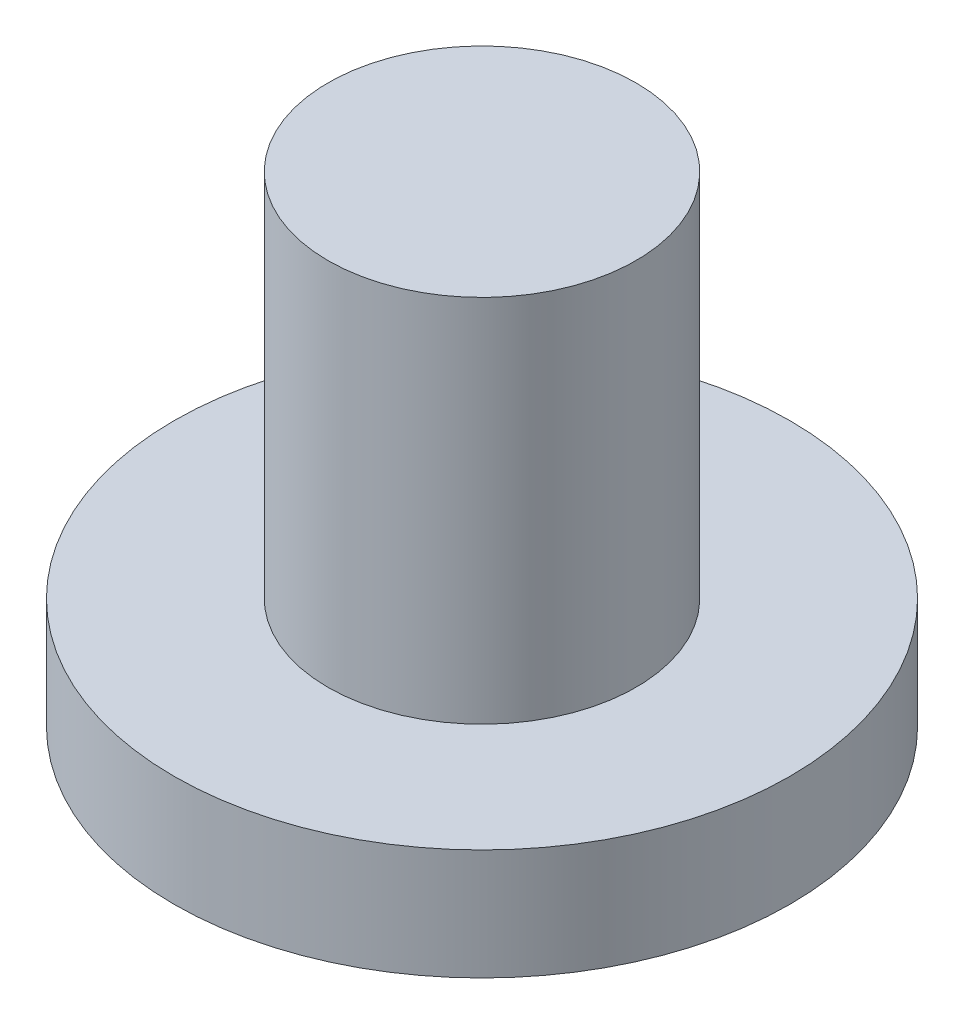
ISO-10303-21;
HEADER;
FILE_DESCRIPTION(('STEP AP214'),'2;1');
FILE_NAME('part.step','',(''),(''),'','','');
FILE_SCHEMA(('AUTOMOTIVE_DESIGN { 1 0 10303 214 1 1 1 1 }'));
ENDSEC;
DATA;
#1=APPLICATION_CONTEXT('core data for automotive mechanical design processes');
#2=APPLICATION_PROTOCOL_DEFINITION('international standard','automotive_design',2000,#1);
#3=PRODUCT_CONTEXT('',#1,'mechanical');
#4=PRODUCT('Part','Part','',(#3));
#5=PRODUCT_RELATED_PRODUCT_CATEGORY('part','',(#4));
#6=PRODUCT_DEFINITION_FORMATION('','',#4);
#7=PRODUCT_DEFINITION_CONTEXT('part definition',#1,'design');
#8=PRODUCT_DEFINITION('design','',#6,#7);
#9=PRODUCT_DEFINITION_SHAPE('','',#8);
#10=(LENGTH_UNIT() NAMED_UNIT(*) SI_UNIT(.MILLI.,.METRE.));
#11=(NAMED_UNIT(*) PLANE_ANGLE_UNIT() SI_UNIT($,.RADIAN.));
#12=(NAMED_UNIT(*) SI_UNIT($,.STERADIAN.) SOLID_ANGLE_UNIT());
#13=UNCERTAINTY_MEASURE_WITH_UNIT(LENGTH_MEASURE(1.E-05),#10,'distance_accuracy_value','');
#14=(GEOMETRIC_REPRESENTATION_CONTEXT(3) GLOBAL_UNCERTAINTY_ASSIGNED_CONTEXT((#13)) GLOBAL_UNIT_ASSIGNED_CONTEXT((#10,
#11,#12)) REPRESENTATION_CONTEXT('',''));
#15=CARTESIAN_POINT('',(0.,0.,0.));
#16=DIRECTION('',(0.,0.,1.));
#17=DIRECTION('',(1.,0.,0.));
#18=AXIS2_PLACEMENT_3D('',#15,#16,#17);
#19=CARTESIAN_POINT('',(0.,0.9,0.));
#20=DIRECTION('',(0.,-1.,0.));
#21=DIRECTION('',(0.,0.,-1.));
#22=AXIS2_PLACEMENT_3D('',#19,#20,#21);
#23=CYLINDRICAL_SURFACE('',#22,2.5);
#24=CARTESIAN_POINT('',(0.,0.9,0.));
#25=DIRECTION('',(0.,1.,0.));
#26=DIRECTION('',(0.,0.,1.));
#27=AXIS2_PLACEMENT_3D('',#24,#25,#26);
#28=CIRCLE('',#27,2.5);
#29=CARTESIAN_POINT('',(0.,0.9,2.5));
#30=VERTEX_POINT('',#29);
#31=EDGE_CURVE('E47',#30,#30,#28,.T.);
#32=ORIENTED_EDGE('',*,*,#31,.F.);
#33=EDGE_LOOP('',(#32));
#34=FACE_BOUND('',#33,.T.);
#35=CARTESIAN_POINT('',(0.,0.,0.));
#36=DIRECTION('',(0.,1.,0.));
#37=DIRECTION('',(0.,0.,1.));
#38=AXIS2_PLACEMENT_3D('',#35,#36,#37);
#39=CIRCLE('',#38,2.5);
#40=CARTESIAN_POINT('',(0.,0.,2.5));
#41=VERTEX_POINT('',#40);
#42=EDGE_CURVE('E42',#41,#41,#39,.T.);
#43=ORIENTED_EDGE('',*,*,#42,.T.);
#44=EDGE_LOOP('',(#43));
#45=FACE_BOUND('',#44,.T.);
#46=ADVANCED_FACE('F39',(#34,#45),#23,.T.);
#47=CARTESIAN_POINT('',(0.,0.9,0.));
#48=DIRECTION('',(0.,1.,0.));
#49=DIRECTION('',(0.,0.,1.));
#50=AXIS2_PLACEMENT_3D('',#47,#48,#49);
#51=PLANE('',#50);
#52=CARTESIAN_POINT('',(0.,0.9,0.));
#53=DIRECTION('',(0.,1.,0.));
#54=DIRECTION('',(0.,0.,1.));
#55=AXIS2_PLACEMENT_3D('',#52,#53,#54);
#56=CIRCLE('',#55,1.25);
#57=CARTESIAN_POINT('',(0.,0.9,1.25));
#58=VERTEX_POINT('',#57);
#59=EDGE_CURVE('E11',#58,#58,#56,.T.);
#60=ORIENTED_EDGE('',*,*,#59,.F.);
#61=EDGE_LOOP('',(#60));
#62=FACE_BOUND('',#61,.T.);
#63=ORIENTED_EDGE('',*,*,#31,.T.);
#64=EDGE_LOOP('',(#63));
#65=FACE_BOUND('',#64,.T.);
#66=ADVANCED_FACE('F159',(#62,#65),#51,.T.);
#67=CARTESIAN_POINT('',(0.,0.,0.));
#68=DIRECTION('',(0.,1.,0.));
#69=DIRECTION('',(0.,0.,1.));
#70=AXIS2_PLACEMENT_3D('',#67,#68,#69);
#71=PLANE('',#70);
#72=DIRECTION('',(-1.,0.,0.));
#73=VECTOR('',#72,1.);
#74=CARTESIAN_POINT('',(0.433012701892219,0.,0.75));
#75=LINE('',#74,#73);
#76=CARTESIAN_POINT('',(0.433012701892219,0.,0.75));
#77=VERTEX_POINT('',#76);
#78=CARTESIAN_POINT('',(-0.43301270189222,0.,0.75));
#79=VERTEX_POINT('',#78);
#80=EDGE_CURVE('E129',#77,#79,#75,.T.);
#81=ORIENTED_EDGE('',*,*,#80,.F.);
#82=DIRECTION('',(-0.5,0.,0.866025403784439));
#83=VECTOR('',#82,1.);
#84=CARTESIAN_POINT('',(0.866025403784438,0.,0.));
#85=LINE('',#84,#83);
#86=CARTESIAN_POINT('',(0.866025403784438,0.,0.));
#87=VERTEX_POINT('',#86);
#88=EDGE_CURVE('E55',#87,#77,#85,.T.);
#89=ORIENTED_EDGE('',*,*,#88,.F.);
#90=DIRECTION('',(0.5,0.,0.866025403784439));
#91=VECTOR('',#90,1.);
#92=CARTESIAN_POINT('',(0.433012701892219,0.,-0.75));
#93=LINE('',#92,#91);
#94=CARTESIAN_POINT('',(0.433012701892219,0.,-0.75));
#95=VERTEX_POINT('',#94);
#96=EDGE_CURVE('E138',#95,#87,#93,.T.);
#97=ORIENTED_EDGE('',*,*,#96,.F.);
#98=DIRECTION('',(1.,0.,0.));
#99=VECTOR('',#98,1.);
#100=CARTESIAN_POINT('',(-0.433012701892219,0.,-0.75));
#101=LINE('',#100,#99);
#102=CARTESIAN_POINT('',(-0.433012701892219,0.,-0.75));
#103=VERTEX_POINT('',#102);
#104=EDGE_CURVE('E136',#103,#95,#101,.T.);
#105=ORIENTED_EDGE('',*,*,#104,.F.);
#106=DIRECTION('',(0.5,0.,-0.866025403784439));
#107=VECTOR('',#106,1.);
#108=CARTESIAN_POINT('',(-0.866025403784439,0.,0.));
#109=LINE('',#108,#107);
#110=CARTESIAN_POINT('',(-0.866025403784439,0.,0.));
#111=VERTEX_POINT('',#110);
#112=EDGE_CURVE('E103',#111,#103,#109,.T.);
#113=ORIENTED_EDGE('',*,*,#112,.F.);
#114=DIRECTION('',(-0.5,0.,-0.866025403784439));
#115=VECTOR('',#114,1.);
#116=CARTESIAN_POINT('',(-0.43301270189222,0.,0.75));
#117=LINE('',#116,#115);
#118=EDGE_CURVE('E132',#79,#111,#117,.T.);
#119=ORIENTED_EDGE('',*,*,#118,.F.);
#120=EDGE_LOOP('',(#81,#89,#97,#105,#113,#119));
#121=FACE_BOUND('',#120,.T.);
#122=ORIENTED_EDGE('',*,*,#42,.F.);
#123=EDGE_LOOP('',(#122));
#124=FACE_BOUND('',#123,.T.);
#125=ADVANCED_FACE('F156',(#121,#124),#71,.F.);
#126=CARTESIAN_POINT('',(0.,3.9,0.));
#127=DIRECTION('',(0.,-1.,0.));
#128=DIRECTION('',(0.,0.,-1.));
#129=AXIS2_PLACEMENT_3D('',#126,#127,#128);
#130=CYLINDRICAL_SURFACE('',#129,1.25);
#131=CARTESIAN_POINT('',(0.,3.9,0.));
#132=DIRECTION('',(0.,1.,0.));
#133=DIRECTION('',(0.,0.,1.));
#134=AXIS2_PLACEMENT_3D('',#131,#132,#133);
#135=CIRCLE('',#134,1.25);
#136=CARTESIAN_POINT('',(0.,3.9,1.25));
#137=VERTEX_POINT('',#136);
#138=EDGE_CURVE('E142',#137,#137,#135,.T.);
#139=ORIENTED_EDGE('',*,*,#138,.F.);
#140=EDGE_LOOP('',(#139));
#141=FACE_BOUND('',#140,.T.);
#142=ORIENTED_EDGE('',*,*,#59,.T.);
#143=EDGE_LOOP('',(#142));
#144=FACE_BOUND('',#143,.T.);
#145=ADVANCED_FACE('F158',(#141,#144),#130,.T.);
#146=CARTESIAN_POINT('',(0.,3.9,0.));
#147=DIRECTION('',(0.,1.,0.));
#148=DIRECTION('',(0.,0.,1.));
#149=AXIS2_PLACEMENT_3D('',#146,#147,#148);
#150=PLANE('',#149);
#151=ORIENTED_EDGE('',*,*,#138,.T.);
#152=EDGE_LOOP('',(#151));
#153=FACE_BOUND('',#152,.T.);
#154=ADVANCED_FACE('F166',(#153),#150,.T.);
#155=CARTESIAN_POINT('',(0.866025403784438,0.5,0.));
#156=DIRECTION('',(0.866025403784439,0.,0.5));
#157=DIRECTION('',(0.5,0.,-0.866025403784439));
#158=AXIS2_PLACEMENT_3D('',#155,#156,#157);
#159=PLANE('',#158);
#160=ORIENTED_EDGE('',*,*,#88,.T.);
#161=DIRECTION('',(0.,-1.,0.));
#162=VECTOR('',#161,1.);
#163=CARTESIAN_POINT('',(0.433012701892219,0.5,0.75));
#164=LINE('',#163,#162);
#165=CARTESIAN_POINT('',(0.433012701892219,0.5,0.75));
#166=VERTEX_POINT('',#165);
#167=EDGE_CURVE('E85',#166,#77,#164,.T.);
#168=ORIENTED_EDGE('',*,*,#167,.F.);
#169=DIRECTION('',(-0.5,0.,0.866025403784439));
#170=VECTOR('',#169,1.);
#171=CARTESIAN_POINT('',(0.866025403784438,0.5,0.));
#172=LINE('',#171,#170);
#173=CARTESIAN_POINT('',(0.866025403784438,0.5,0.));
#174=VERTEX_POINT('',#173);
#175=EDGE_CURVE('E140',#174,#166,#172,.T.);
#176=ORIENTED_EDGE('',*,*,#175,.F.);
#177=DIRECTION('',(0.,-1.,0.));
#178=VECTOR('',#177,1.);
#179=CARTESIAN_POINT('',(0.866025403784438,0.5,0.));
#180=LINE('',#179,#178);
#181=EDGE_CURVE('E63',#174,#87,#180,.T.);
#182=ORIENTED_EDGE('',*,*,#181,.T.);
#183=EDGE_LOOP('',(#160,#168,#176,#182));
#184=FACE_BOUND('',#183,.T.);
#185=ADVANCED_FACE('F189',(#184),#159,.F.);
#186=CARTESIAN_POINT('',(0.433012701892219,0.5,-0.75));
#187=DIRECTION('',(0.866025403784439,0.,-0.5));
#188=DIRECTION('',(-0.5,0.,-0.866025403784439));
#189=AXIS2_PLACEMENT_3D('',#186,#187,#188);
#190=PLANE('',#189);
#191=ORIENTED_EDGE('',*,*,#96,.T.);
#192=ORIENTED_EDGE('',*,*,#181,.F.);
#193=DIRECTION('',(0.5,0.,0.866025403784439));
#194=VECTOR('',#193,1.);
#195=CARTESIAN_POINT('',(0.433012701892219,0.5,-0.75));
#196=LINE('',#195,#194);
#197=CARTESIAN_POINT('',(0.433012701892219,0.5,-0.75));
#198=VERTEX_POINT('',#197);
#199=EDGE_CURVE('E115',#198,#174,#196,.T.);
#200=ORIENTED_EDGE('',*,*,#199,.F.);
#201=DIRECTION('',(0.,-1.,0.));
#202=VECTOR('',#201,1.);
#203=CARTESIAN_POINT('',(0.433012701892219,0.5,-0.75));
#204=LINE('',#203,#202);
#205=EDGE_CURVE('E107',#198,#95,#204,.T.);
#206=ORIENTED_EDGE('',*,*,#205,.T.);
#207=EDGE_LOOP('',(#191,#192,#200,#206));
#208=FACE_BOUND('',#207,.T.);
#209=ADVANCED_FACE('F198',(#208),#190,.F.);
#210=CARTESIAN_POINT('',(-0.433012701892219,0.5,-0.75));
#211=DIRECTION('',(0.,0.,-1.));
#212=DIRECTION('',(-1.,0.,0.));
#213=AXIS2_PLACEMENT_3D('',#210,#211,#212);
#214=PLANE('',#213);
#215=ORIENTED_EDGE('',*,*,#104,.T.);
#216=ORIENTED_EDGE('',*,*,#205,.F.);
#217=DIRECTION('',(1.,0.,0.));
#218=VECTOR('',#217,1.);
#219=CARTESIAN_POINT('',(-0.433012701892219,0.5,-0.75));
#220=LINE('',#219,#218);
#221=CARTESIAN_POINT('',(-0.433012701892219,0.5,-0.75));
#222=VERTEX_POINT('',#221);
#223=EDGE_CURVE('E111',#222,#198,#220,.T.);
#224=ORIENTED_EDGE('',*,*,#223,.F.);
#225=DIRECTION('',(0.,-1.,0.));
#226=VECTOR('',#225,1.);
#227=CARTESIAN_POINT('',(-0.433012701892219,0.5,-0.75));
#228=LINE('',#227,#226);
#229=EDGE_CURVE('E96',#222,#103,#228,.T.);
#230=ORIENTED_EDGE('',*,*,#229,.T.);
#231=EDGE_LOOP('',(#215,#216,#224,#230));
#232=FACE_BOUND('',#231,.T.);
#233=ADVANCED_FACE('F112',(#232),#214,.F.);
#234=CARTESIAN_POINT('',(-0.866025403784439,0.5,0.));
#235=DIRECTION('',(-0.866025403784439,0.,-0.5));
#236=DIRECTION('',(-0.5,0.,0.866025403784439));
#237=AXIS2_PLACEMENT_3D('',#234,#235,#236);
#238=PLANE('',#237);
#239=ORIENTED_EDGE('',*,*,#112,.T.);
#240=ORIENTED_EDGE('',*,*,#229,.F.);
#241=DIRECTION('',(0.5,0.,-0.866025403784439));
#242=VECTOR('',#241,1.);
#243=CARTESIAN_POINT('',(-0.866025403784439,0.5,0.));
#244=LINE('',#243,#242);
#245=CARTESIAN_POINT('',(-0.866025403784439,0.5,0.));
#246=VERTEX_POINT('',#245);
#247=EDGE_CURVE('E100',#246,#222,#244,.T.);
#248=ORIENTED_EDGE('',*,*,#247,.F.);
#249=DIRECTION('',(0.,-1.,0.));
#250=VECTOR('',#249,1.);
#251=CARTESIAN_POINT('',(-0.866025403784439,0.5,0.));
#252=LINE('',#251,#250);
#253=EDGE_CURVE('E108',#246,#111,#252,.T.);
#254=ORIENTED_EDGE('',*,*,#253,.T.);
#255=EDGE_LOOP('',(#239,#240,#248,#254));
#256=FACE_BOUND('',#255,.T.);
#257=ADVANCED_FACE('F98',(#256),#238,.F.);
#258=CARTESIAN_POINT('',(-0.43301270189222,0.5,0.75));
#259=DIRECTION('',(-0.866025403784439,0.,0.5));
#260=DIRECTION('',(0.5,0.,0.866025403784439));
#261=AXIS2_PLACEMENT_3D('',#258,#259,#260);
#262=PLANE('',#261);
#263=ORIENTED_EDGE('',*,*,#118,.T.);
#264=ORIENTED_EDGE('',*,*,#253,.F.);
#265=DIRECTION('',(-0.5,0.,-0.866025403784439));
#266=VECTOR('',#265,1.);
#267=CARTESIAN_POINT('',(-0.43301270189222,0.5,0.75));
#268=LINE('',#267,#266);
#269=CARTESIAN_POINT('',(-0.43301270189222,0.5,0.75));
#270=VERTEX_POINT('',#269);
#271=EDGE_CURVE('E121',#270,#246,#268,.T.);
#272=ORIENTED_EDGE('',*,*,#271,.F.);
#273=DIRECTION('',(0.,-1.,0.));
#274=VECTOR('',#273,1.);
#275=CARTESIAN_POINT('',(-0.43301270189222,0.5,0.75));
#276=LINE('',#275,#274);
#277=EDGE_CURVE('E145',#270,#79,#276,.T.);
#278=ORIENTED_EDGE('',*,*,#277,.T.);
#279=EDGE_LOOP('',(#263,#264,#272,#278));
#280=FACE_BOUND('',#279,.T.);
#281=ADVANCED_FACE('F217',(#280),#262,.F.);
#282=CARTESIAN_POINT('',(0.433012701892219,0.5,0.75));
#283=DIRECTION('',(0.,0.,1.));
#284=DIRECTION('',(1.,0.,0.));
#285=AXIS2_PLACEMENT_3D('',#282,#283,#284);
#286=PLANE('',#285);
#287=ORIENTED_EDGE('',*,*,#80,.T.);
#288=ORIENTED_EDGE('',*,*,#277,.F.);
#289=DIRECTION('',(-1.,0.,0.));
#290=VECTOR('',#289,1.);
#291=CARTESIAN_POINT('',(0.433012701892219,0.5,0.75));
#292=LINE('',#291,#290);
#293=EDGE_CURVE('E123',#166,#270,#292,.T.);
#294=ORIENTED_EDGE('',*,*,#293,.F.);
#295=ORIENTED_EDGE('',*,*,#167,.T.);
#296=EDGE_LOOP('',(#287,#288,#294,#295));
#297=FACE_BOUND('',#296,.T.);
#298=ADVANCED_FACE('F224',(#297),#286,.F.);
#299=CARTESIAN_POINT('',(0.,0.5,0.));
#300=DIRECTION('',(0.,-1.,0.));
#301=DIRECTION('',(0.,0.,-1.));
#302=AXIS2_PLACEMENT_3D('',#299,#300,#301);
#303=PLANE('',#302);
#304=ORIENTED_EDGE('',*,*,#175,.T.);
#305=ORIENTED_EDGE('',*,*,#293,.T.);
#306=ORIENTED_EDGE('',*,*,#271,.T.);
#307=ORIENTED_EDGE('',*,*,#247,.T.);
#308=ORIENTED_EDGE('',*,*,#223,.T.);
#309=ORIENTED_EDGE('',*,*,#199,.T.);
#310=EDGE_LOOP('',(#304,#305,#306,#307,#308,#309));
#311=FACE_BOUND('',#310,.T.);
#312=ADVANCED_FACE('F118',(#311),#303,.T.);
#313=CLOSED_SHELL('',(#46,#66,#125,#145,#154,#185,#209,#233,#257,#281,#298,#312));
#314=MANIFOLD_SOLID_BREP('B2',#313);
#315=ADVANCED_BREP_SHAPE_REPRESENTATION('',(#18,#314),#14);
#316=SHAPE_DEFINITION_REPRESENTATION(#9,#315);
ENDSEC;
END-ISO-10303-21;
